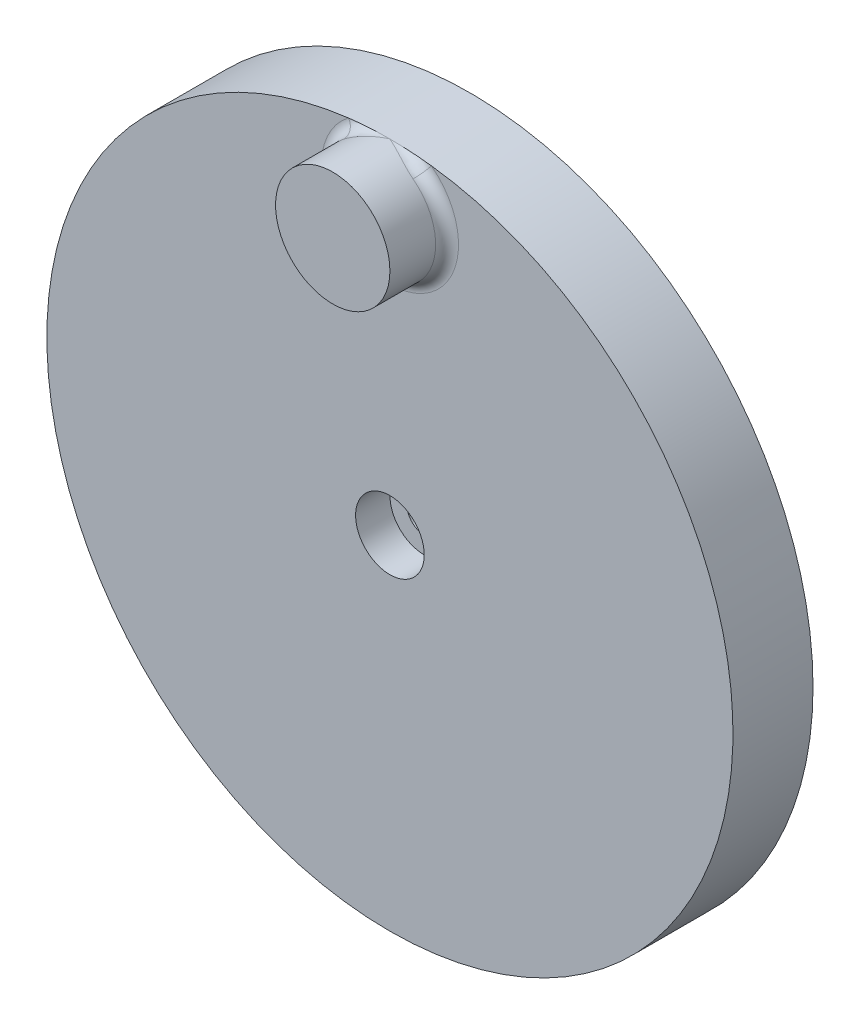
ISO-10303-21;
HEADER;
FILE_DESCRIPTION(('STEP AP214'),'2;1');
FILE_NAME('part.step','',(''),(''),'','','');
FILE_SCHEMA(('AUTOMOTIVE_DESIGN { 1 0 10303 214 1 1 1 1 }'));
ENDSEC;
DATA;
#1=APPLICATION_CONTEXT('core data for automotive mechanical design processes');
#2=APPLICATION_PROTOCOL_DEFINITION('international standard','automotive_design',2000,#1);
#3=PRODUCT_CONTEXT('',#1,'mechanical');
#4=PRODUCT('Part','Part','',(#3));
#5=PRODUCT_RELATED_PRODUCT_CATEGORY('part','',(#4));
#6=PRODUCT_DEFINITION_FORMATION('','',#4);
#7=PRODUCT_DEFINITION_CONTEXT('part definition',#1,'design');
#8=PRODUCT_DEFINITION('design','',#6,#7);
#9=PRODUCT_DEFINITION_SHAPE('','',#8);
#10=(LENGTH_UNIT() NAMED_UNIT(*) SI_UNIT(.MILLI.,.METRE.));
#11=(NAMED_UNIT(*) PLANE_ANGLE_UNIT() SI_UNIT($,.RADIAN.));
#12=(NAMED_UNIT(*) SI_UNIT($,.STERADIAN.) SOLID_ANGLE_UNIT());
#13=UNCERTAINTY_MEASURE_WITH_UNIT(LENGTH_MEASURE(1.E-05),#10,'distance_accuracy_value','');
#14=(GEOMETRIC_REPRESENTATION_CONTEXT(3) GLOBAL_UNCERTAINTY_ASSIGNED_CONTEXT((#13)) GLOBAL_UNIT_ASSIGNED_CONTEXT((#10,
#11,#12)) REPRESENTATION_CONTEXT('',''));
#15=CARTESIAN_POINT('',(0.,0.,0.));
#16=DIRECTION('',(0.,0.,1.));
#17=DIRECTION('',(1.,0.,0.));
#18=AXIS2_PLACEMENT_3D('',#15,#16,#17);
#19=CARTESIAN_POINT('',(0.,0.,7.));
#20=DIRECTION('',(0.,0.,-1.));
#21=DIRECTION('',(-1.,0.,0.));
#22=AXIS2_PLACEMENT_3D('',#19,#20,#21);
#23=CYLINDRICAL_SURFACE('',#22,1.5);
#24=CARTESIAN_POINT('',(0.,0.,2.));
#25=DIRECTION('',(0.,0.,-1.));
#26=DIRECTION('',(-1.,0.,0.));
#27=AXIS2_PLACEMENT_3D('',#24,#25,#26);
#28=CIRCLE('',#27,1.5);
#29=CARTESIAN_POINT('',(-1.5,0.,2.));
#30=VERTEX_POINT('',#29);
#31=EDGE_CURVE('E281',#30,#30,#28,.T.);
#32=ORIENTED_EDGE('',*,*,#31,.T.);
#33=EDGE_LOOP('',(#32));
#34=FACE_BOUND('',#33,.T.);
#35=CARTESIAN_POINT('',(0.,0.,4.));
#36=DIRECTION('',(0.,0.,1.));
#37=DIRECTION('',(1.,0.,0.));
#38=AXIS2_PLACEMENT_3D('',#35,#36,#37);
#39=CIRCLE('',#38,1.5);
#40=CARTESIAN_POINT('',(1.5,0.,4.));
#41=VERTEX_POINT('',#40);
#42=EDGE_CURVE('E182',#41,#41,#39,.F.);
#43=ORIENTED_EDGE('',*,*,#42,.F.);
#44=EDGE_LOOP('',(#43));
#45=FACE_BOUND('',#44,.T.);
#46=ADVANCED_FACE('F39',(#34,#45),#23,.F.);
#47=CARTESIAN_POINT('',(0.,0.,0.));
#48=DIRECTION('',(0.,0.,1.));
#49=DIRECTION('',(1.,0.,0.));
#50=AXIS2_PLACEMENT_3D('',#47,#48,#49);
#51=PLANE('',#50);
#52=CARTESIAN_POINT('',(0.,0.,0.));
#53=DIRECTION('',(0.,0.,1.));
#54=DIRECTION('',(1.,0.,0.));
#55=AXIS2_PLACEMENT_3D('',#52,#53,#54);
#56=CIRCLE('',#55,30.);
#57=CARTESIAN_POINT('',(30.,0.,0.));
#58=VERTEX_POINT('',#57);
#59=EDGE_CURVE('E143',#58,#58,#56,.T.);
#60=ORIENTED_EDGE('',*,*,#59,.F.);
#61=EDGE_LOOP('',(#60));
#62=FACE_BOUND('',#61,.T.);
#63=CARTESIAN_POINT('',(0.,16.5,0.));
#64=DIRECTION('',(0.,0.,1.));
#65=DIRECTION('',(-1.,0.,0.));
#66=AXIS2_PLACEMENT_3D('',#63,#64,#65);
#67=CIRCLE('',#66,2.5);
#68=CARTESIAN_POINT('',(2.4758529550033,16.8466296946331,0.));
#69=VERTEX_POINT('',#68);
#70=CARTESIAN_POINT('',(-2.4758529550033,16.8466296946331,0.));
#71=VERTEX_POINT('',#70);
#72=EDGE_CURVE('E270',#69,#71,#67,.T.);
#73=ORIENTED_EDGE('',*,*,#72,.T.);
#74=DIRECTION('',(-0.138651877853248,-0.990341182001318,0.));
#75=VECTOR('',#74,1.);
#76=CARTESIAN_POINT('',(-2.4758529550033,16.8466296946331,0.));
#77=LINE('',#76,#75);
#78=CARTESIAN_POINT('',(-4.3,3.81739439932528,0.));
#79=VERTEX_POINT('',#78);
#80=EDGE_CURVE('E280',#71,#79,#77,.T.);
#81=ORIENTED_EDGE('',*,*,#80,.T.);
#82=CARTESIAN_POINT('',(0.,0.,0.));
#83=DIRECTION('',(0.,0.,1.));
#84=DIRECTION('',(1.,0.,0.));
#85=AXIS2_PLACEMENT_3D('',#82,#83,#84);
#86=CIRCLE('',#85,5.75000000000004);
#87=CARTESIAN_POINT('',(-4.3,-3.81739439932528,0.));
#88=VERTEX_POINT('',#87);
#89=EDGE_CURVE('E342',#79,#88,#86,.T.);
#90=ORIENTED_EDGE('',*,*,#89,.T.);
#91=DIRECTION('',(0.138651877853248,-0.990341182001318,0.));
#92=VECTOR('',#91,1.);
#93=CARTESIAN_POINT('',(-4.3,-3.81739439932528,0.));
#94=LINE('',#93,#92);
#95=CARTESIAN_POINT('',(-2.4758529550033,-16.8466296946331,0.));
#96=VERTEX_POINT('',#95);
#97=EDGE_CURVE('E345',#88,#96,#94,.T.);
#98=ORIENTED_EDGE('',*,*,#97,.T.);
#99=CARTESIAN_POINT('',(0.,-16.5,0.));
#100=DIRECTION('',(0.,0.,1.));
#101=DIRECTION('',(1.,0.,0.));
#102=AXIS2_PLACEMENT_3D('',#99,#100,#101);
#103=CIRCLE('',#102,2.5);
#104=CARTESIAN_POINT('',(2.4758529550033,-16.8466296946331,0.));
#105=VERTEX_POINT('',#104);
#106=EDGE_CURVE('E348',#96,#105,#103,.T.);
#107=ORIENTED_EDGE('',*,*,#106,.T.);
#108=DIRECTION('',(0.138651877853248,0.990341182001318,0.));
#109=VECTOR('',#108,1.);
#110=CARTESIAN_POINT('',(4.3,-3.81739439932528,0.));
#111=LINE('',#110,#109);
#112=CARTESIAN_POINT('',(4.3,-3.81739439932528,0.));
#113=VERTEX_POINT('',#112);
#114=EDGE_CURVE('E298',#105,#113,#111,.T.);
#115=ORIENTED_EDGE('',*,*,#114,.T.);
#116=CARTESIAN_POINT('',(0.,0.,0.));
#117=DIRECTION('',(0.,0.,1.));
#118=DIRECTION('',(-1.,0.,0.));
#119=AXIS2_PLACEMENT_3D('',#116,#117,#118);
#120=CIRCLE('',#119,5.75000000000001);
#121=CARTESIAN_POINT('',(4.3,3.81739439932528,0.));
#122=VERTEX_POINT('',#121);
#123=EDGE_CURVE('E293',#113,#122,#120,.T.);
#124=ORIENTED_EDGE('',*,*,#123,.T.);
#125=DIRECTION('',(-0.138651877853248,0.990341182001318,0.));
#126=VECTOR('',#125,1.);
#127=CARTESIAN_POINT('',(2.4758529550033,16.8466296946331,0.));
#128=LINE('',#127,#126);
#129=EDGE_CURVE('E285',#122,#69,#128,.T.);
#130=ORIENTED_EDGE('',*,*,#129,.T.);
#131=EDGE_LOOP('',(#73,#81,#90,#98,#107,#115,#124,#130));
#132=FACE_BOUND('',#131,.T.);
#133=ADVANCED_FACE('F190',(#62,#132),#51,.F.);
#134=CARTESIAN_POINT('',(0.,0.,7.));
#135=DIRECTION('',(0.,0.,-1.));
#136=DIRECTION('',(-1.,0.,0.));
#137=AXIS2_PLACEMENT_3D('',#134,#135,#136);
#138=CYLINDRICAL_SURFACE('',#137,30.);
#139=CARTESIAN_POINT('',(0.,0.,7.));
#140=DIRECTION('',(0.,0.,1.));
#141=DIRECTION('',(1.,0.,0.));
#142=AXIS2_PLACEMENT_3D('',#139,#140,#141);
#143=CIRCLE('',#142,30.);
#144=CARTESIAN_POINT('',(0.,30.,7.));
#145=VERTEX_POINT('',#144);
#146=CARTESIAN_POINT('',(-3.62651347715682,29.78,7.));
#147=VERTEX_POINT('',#146);
#148=EDGE_CURVE('E132',#145,#147,#143,.T.);
#149=ORIENTED_EDGE('',*,*,#148,.F.);
#150=CARTESIAN_POINT('',(3.62651347715684,29.78,7.));
#151=VERTEX_POINT('',#150);
#152=EDGE_CURVE('E60',#151,#145,#143,.T.);
#153=ORIENTED_EDGE('',*,*,#152,.F.);
#154=EDGE_CURVE('E137',#147,#151,#143,.T.);
#155=ORIENTED_EDGE('',*,*,#154,.F.);
#156=EDGE_LOOP('',(#149,#153,#155));
#157=FACE_BOUND('',#156,.T.);
#158=ORIENTED_EDGE('',*,*,#59,.T.);
#159=EDGE_LOOP('',(#158));
#160=FACE_BOUND('',#159,.T.);
#161=ADVANCED_FACE('F135',(#157,#160),#138,.T.);
#162=CARTESIAN_POINT('',(0.,0.,7.));
#163=DIRECTION('',(0.,0.,1.));
#164=DIRECTION('',(1.,0.,0.));
#165=AXIS2_PLACEMENT_3D('',#162,#163,#164);
#166=PLANE('',#165);
#167=CARTESIAN_POINT('',(0.,0.,7.));
#168=DIRECTION('',(0.,0.,1.));
#169=DIRECTION('',(1.,0.,0.));
#170=AXIS2_PLACEMENT_3D('',#167,#168,#169);
#171=CIRCLE('',#170,3.);
#172=CARTESIAN_POINT('',(3.,0.,7.));
#173=VERTEX_POINT('',#172);
#174=EDGE_CURVE('E321',#173,#173,#171,.T.);
#175=ORIENTED_EDGE('',*,*,#174,.F.);
#176=EDGE_LOOP('',(#175));
#177=FACE_BOUND('',#176,.T.);
#178=ORIENTED_EDGE('',*,*,#154,.T.);
#179=CARTESIAN_POINT('',(0.,25.,7.));
#180=DIRECTION('',(0.,0.,1.));
#181=DIRECTION('',(1.,0.,0.));
#182=AXIS2_PLACEMENT_3D('',#179,#180,#181);
#183=CIRCLE('',#182,6.);
#184=EDGE_CURVE('E11',#151,#147,#183,.F.);
#185=ORIENTED_EDGE('',*,*,#184,.T.);
#186=EDGE_LOOP('',(#178,#185));
#187=FACE_BOUND('',#186,.T.);
#188=ADVANCED_FACE('F189',(#177,#187),#166,.T.);
#189=CARTESIAN_POINT('',(0.,16.5,2.));
#190=DIRECTION('',(0.,0.,-1.));
#191=DIRECTION('',(-1.,0.,0.));
#192=AXIS2_PLACEMENT_3D('',#189,#190,#191);
#193=CYLINDRICAL_SURFACE('',#192,2.5);
#194=ORIENTED_EDGE('',*,*,#72,.F.);
#195=DIRECTION('',(0.,0.,-1.));
#196=VECTOR('',#195,1.);
#197=CARTESIAN_POINT('',(2.4758529550033,16.8466296946331,2.));
#198=LINE('',#197,#196);
#199=CARTESIAN_POINT('',(2.4758529550033,16.8466296946331,2.));
#200=VERTEX_POINT('',#199);
#201=EDGE_CURVE('E273',#200,#69,#198,.T.);
#202=ORIENTED_EDGE('',*,*,#201,.F.);
#203=CARTESIAN_POINT('',(0.,16.5,2.));
#204=DIRECTION('',(0.,0.,1.));
#205=DIRECTION('',(-1.,0.,0.));
#206=AXIS2_PLACEMENT_3D('',#203,#204,#205);
#207=CIRCLE('',#206,2.5);
#208=CARTESIAN_POINT('',(-2.4758529550033,16.8466296946331,2.));
#209=VERTEX_POINT('',#208);
#210=EDGE_CURVE('E294',#200,#209,#207,.T.);
#211=ORIENTED_EDGE('',*,*,#210,.T.);
#212=DIRECTION('',(0.,0.,-1.));
#213=VECTOR('',#212,1.);
#214=CARTESIAN_POINT('',(-2.4758529550033,16.8466296946331,2.));
#215=LINE('',#214,#213);
#216=EDGE_CURVE('E276',#209,#71,#215,.T.);
#217=ORIENTED_EDGE('',*,*,#216,.T.);
#218=EDGE_LOOP('',(#194,#202,#211,#217));
#219=FACE_BOUND('',#218,.T.);
#220=ADVANCED_FACE('F259',(#219),#193,.F.);
#221=CARTESIAN_POINT('',(-2.4758529550033,16.8466296946331,2.));
#222=DIRECTION('',(0.990341182001318,-0.138651877853248,0.));
#223=DIRECTION('',(0.138651877853248,0.990341182001318,0.));
#224=AXIS2_PLACEMENT_3D('',#221,#222,#223);
#225=PLANE('',#224);
#226=ORIENTED_EDGE('',*,*,#80,.F.);
#227=ORIENTED_EDGE('',*,*,#216,.F.);
#228=DIRECTION('',(-0.138651877853248,-0.990341182001318,0.));
#229=VECTOR('',#228,1.);
#230=CARTESIAN_POINT('',(-2.4758529550033,16.8466296946331,2.));
#231=LINE('',#230,#229);
#232=CARTESIAN_POINT('',(-4.3,3.81739439932528,2.));
#233=VERTEX_POINT('',#232);
#234=EDGE_CURVE('E296',#209,#233,#231,.T.);
#235=ORIENTED_EDGE('',*,*,#234,.T.);
#236=DIRECTION('',(0.,0.,-1.));
#237=VECTOR('',#236,1.);
#238=CARTESIAN_POINT('',(-4.3,3.81739439932528,2.));
#239=LINE('',#238,#237);
#240=EDGE_CURVE('E311',#233,#79,#239,.T.);
#241=ORIENTED_EDGE('',*,*,#240,.T.);
#242=EDGE_LOOP('',(#226,#227,#235,#241));
#243=FACE_BOUND('',#242,.T.);
#244=ADVANCED_FACE('F256',(#243),#225,.T.);
#245=CARTESIAN_POINT('',(0.,0.,2.));
#246=DIRECTION('',(0.,0.,-1.));
#247=DIRECTION('',(-1.,0.,0.));
#248=AXIS2_PLACEMENT_3D('',#245,#246,#247);
#249=CYLINDRICAL_SURFACE('',#248,5.75000000000004);
#250=ORIENTED_EDGE('',*,*,#89,.F.);
#251=ORIENTED_EDGE('',*,*,#240,.F.);
#252=CARTESIAN_POINT('',(0.,0.,2.));
#253=DIRECTION('',(0.,0.,1.));
#254=DIRECTION('',(1.,0.,0.));
#255=AXIS2_PLACEMENT_3D('',#252,#253,#254);
#256=CIRCLE('',#255,5.75000000000004);
#257=CARTESIAN_POINT('',(-4.3,-3.81739439932528,2.));
#258=VERTEX_POINT('',#257);
#259=EDGE_CURVE('E330',#233,#258,#256,.T.);
#260=ORIENTED_EDGE('',*,*,#259,.T.);
#261=DIRECTION('',(0.,0.,-1.));
#262=VECTOR('',#261,1.);
#263=CARTESIAN_POINT('',(-4.3,-3.81739439932528,2.));
#264=LINE('',#263,#262);
#265=EDGE_CURVE('E309',#258,#88,#264,.T.);
#266=ORIENTED_EDGE('',*,*,#265,.T.);
#267=EDGE_LOOP('',(#250,#251,#260,#266));
#268=FACE_BOUND('',#267,.T.);
#269=ADVANCED_FACE('F252',(#268),#249,.F.);
#270=CARTESIAN_POINT('',(-4.3,-3.81739439932528,2.));
#271=DIRECTION('',(0.990341182001318,0.138651877853248,0.));
#272=DIRECTION('',(-0.138651877853248,0.990341182001318,0.));
#273=AXIS2_PLACEMENT_3D('',#270,#271,#272);
#274=PLANE('',#273);
#275=ORIENTED_EDGE('',*,*,#97,.F.);
#276=ORIENTED_EDGE('',*,*,#265,.F.);
#277=DIRECTION('',(0.138651877853248,-0.990341182001318,0.));
#278=VECTOR('',#277,1.);
#279=CARTESIAN_POINT('',(-4.3,-3.81739439932528,2.));
#280=LINE('',#279,#278);
#281=CARTESIAN_POINT('',(-2.4758529550033,-16.8466296946331,2.));
#282=VERTEX_POINT('',#281);
#283=EDGE_CURVE('E332',#258,#282,#280,.T.);
#284=ORIENTED_EDGE('',*,*,#283,.T.);
#285=DIRECTION('',(0.,0.,-1.));
#286=VECTOR('',#285,1.);
#287=CARTESIAN_POINT('',(-2.4758529550033,-16.8466296946331,2.));
#288=LINE('',#287,#286);
#289=EDGE_CURVE('E307',#282,#96,#288,.T.);
#290=ORIENTED_EDGE('',*,*,#289,.T.);
#291=EDGE_LOOP('',(#275,#276,#284,#290));
#292=FACE_BOUND('',#291,.T.);
#293=ADVANCED_FACE('F248',(#292),#274,.T.);
#294=CARTESIAN_POINT('',(0.,-16.5,2.));
#295=DIRECTION('',(0.,0.,-1.));
#296=DIRECTION('',(-1.,0.,0.));
#297=AXIS2_PLACEMENT_3D('',#294,#295,#296);
#298=CYLINDRICAL_SURFACE('',#297,2.5);
#299=ORIENTED_EDGE('',*,*,#106,.F.);
#300=ORIENTED_EDGE('',*,*,#289,.F.);
#301=CARTESIAN_POINT('',(0.,-16.5,2.));
#302=DIRECTION('',(0.,0.,1.));
#303=DIRECTION('',(1.,0.,0.));
#304=AXIS2_PLACEMENT_3D('',#301,#302,#303);
#305=CIRCLE('',#304,2.5);
#306=CARTESIAN_POINT('',(2.4758529550033,-16.8466296946331,2.));
#307=VERTEX_POINT('',#306);
#308=EDGE_CURVE('E334',#282,#307,#305,.T.);
#309=ORIENTED_EDGE('',*,*,#308,.T.);
#310=DIRECTION('',(0.,0.,-1.));
#311=VECTOR('',#310,1.);
#312=CARTESIAN_POINT('',(2.4758529550033,-16.8466296946331,2.));
#313=LINE('',#312,#311);
#314=EDGE_CURVE('E305',#307,#105,#313,.T.);
#315=ORIENTED_EDGE('',*,*,#314,.T.);
#316=EDGE_LOOP('',(#299,#300,#309,#315));
#317=FACE_BOUND('',#316,.T.);
#318=ADVANCED_FACE('F244',(#317),#298,.F.);
#319=CARTESIAN_POINT('',(4.3,-3.81739439932528,2.));
#320=DIRECTION('',(-0.990341182001318,0.138651877853248,0.));
#321=DIRECTION('',(-0.138651877853248,-0.990341182001318,0.));
#322=AXIS2_PLACEMENT_3D('',#319,#320,#321);
#323=PLANE('',#322);
#324=ORIENTED_EDGE('',*,*,#114,.F.);
#325=ORIENTED_EDGE('',*,*,#314,.F.);
#326=DIRECTION('',(0.138651877853248,0.990341182001318,0.));
#327=VECTOR('',#326,1.);
#328=CARTESIAN_POINT('',(4.3,-3.81739439932528,2.));
#329=LINE('',#328,#327);
#330=CARTESIAN_POINT('',(4.3,-3.81739439932528,2.));
#331=VERTEX_POINT('',#330);
#332=EDGE_CURVE('E336',#307,#331,#329,.T.);
#333=ORIENTED_EDGE('',*,*,#332,.T.);
#334=DIRECTION('',(0.,0.,-1.));
#335=VECTOR('',#334,1.);
#336=CARTESIAN_POINT('',(4.3,-3.81739439932528,2.));
#337=LINE('',#336,#335);
#338=EDGE_CURVE('E303',#331,#113,#337,.T.);
#339=ORIENTED_EDGE('',*,*,#338,.T.);
#340=EDGE_LOOP('',(#324,#325,#333,#339));
#341=FACE_BOUND('',#340,.T.);
#342=ADVANCED_FACE('F240',(#341),#323,.T.);
#343=CARTESIAN_POINT('',(0.,0.,2.));
#344=DIRECTION('',(0.,0.,-1.));
#345=DIRECTION('',(-1.,0.,0.));
#346=AXIS2_PLACEMENT_3D('',#343,#344,#345);
#347=CYLINDRICAL_SURFACE('',#346,5.75000000000001);
#348=ORIENTED_EDGE('',*,*,#123,.F.);
#349=ORIENTED_EDGE('',*,*,#338,.F.);
#350=CARTESIAN_POINT('',(0.,0.,2.));
#351=DIRECTION('',(0.,0.,1.));
#352=DIRECTION('',(-1.,0.,0.));
#353=AXIS2_PLACEMENT_3D('',#350,#351,#352);
#354=CIRCLE('',#353,5.75000000000001);
#355=CARTESIAN_POINT('',(4.3,3.81739439932528,2.));
#356=VERTEX_POINT('',#355);
#357=EDGE_CURVE('E338',#331,#356,#354,.T.);
#358=ORIENTED_EDGE('',*,*,#357,.T.);
#359=DIRECTION('',(0.,0.,-1.));
#360=VECTOR('',#359,1.);
#361=CARTESIAN_POINT('',(4.3,3.81739439932528,2.));
#362=LINE('',#361,#360);
#363=EDGE_CURVE('E289',#356,#122,#362,.T.);
#364=ORIENTED_EDGE('',*,*,#363,.T.);
#365=EDGE_LOOP('',(#348,#349,#358,#364));
#366=FACE_BOUND('',#365,.T.);
#367=ADVANCED_FACE('F236',(#366),#347,.F.);
#368=CARTESIAN_POINT('',(2.4758529550033,16.8466296946331,2.));
#369=DIRECTION('',(-0.990341182001318,-0.138651877853248,0.));
#370=DIRECTION('',(0.138651877853248,-0.990341182001318,0.));
#371=AXIS2_PLACEMENT_3D('',#368,#369,#370);
#372=PLANE('',#371);
#373=ORIENTED_EDGE('',*,*,#129,.F.);
#374=ORIENTED_EDGE('',*,*,#363,.F.);
#375=DIRECTION('',(-0.138651877853248,0.990341182001318,0.));
#376=VECTOR('',#375,1.);
#377=CARTESIAN_POINT('',(2.4758529550033,16.8466296946331,2.));
#378=LINE('',#377,#376);
#379=EDGE_CURVE('E288',#356,#200,#378,.T.);
#380=ORIENTED_EDGE('',*,*,#379,.T.);
#381=ORIENTED_EDGE('',*,*,#201,.T.);
#382=EDGE_LOOP('',(#373,#374,#380,#381));
#383=FACE_BOUND('',#382,.T.);
#384=ADVANCED_FACE('F232',(#383),#372,.T.);
#385=CARTESIAN_POINT('',(0.,16.5,2.));
#386=DIRECTION('',(0.,0.,-1.));
#387=DIRECTION('',(-1.,0.,0.));
#388=AXIS2_PLACEMENT_3D('',#385,#386,#387);
#389=PLANE('',#388);
#390=ORIENTED_EDGE('',*,*,#31,.F.);
#391=EDGE_LOOP('',(#390));
#392=FACE_BOUND('',#391,.T.);
#393=ORIENTED_EDGE('',*,*,#210,.F.);
#394=ORIENTED_EDGE('',*,*,#379,.F.);
#395=ORIENTED_EDGE('',*,*,#357,.F.);
#396=ORIENTED_EDGE('',*,*,#332,.F.);
#397=ORIENTED_EDGE('',*,*,#308,.F.);
#398=ORIENTED_EDGE('',*,*,#283,.F.);
#399=ORIENTED_EDGE('',*,*,#259,.F.);
#400=ORIENTED_EDGE('',*,*,#234,.F.);
#401=EDGE_LOOP('',(#393,#394,#395,#396,#397,#398,#399,#400));
#402=FACE_BOUND('',#401,.T.);
#403=ADVANCED_FACE('F229',(#392,#402),#389,.T.);
#404=CARTESIAN_POINT('',(0.,0.,4.));
#405=DIRECTION('',(0.,0.,1.));
#406=DIRECTION('',(1.,0.,0.));
#407=AXIS2_PLACEMENT_3D('',#404,#405,#406);
#408=PLANE('',#407);
#409=CARTESIAN_POINT('',(0.,0.,4.));
#410=DIRECTION('',(0.,0.,1.));
#411=DIRECTION('',(1.,0.,0.));
#412=AXIS2_PLACEMENT_3D('',#409,#410,#411);
#413=CIRCLE('',#412,3.);
#414=CARTESIAN_POINT('',(3.,0.,4.));
#415=VERTEX_POINT('',#414);
#416=EDGE_CURVE('E317',#415,#415,#413,.T.);
#417=ORIENTED_EDGE('',*,*,#416,.T.);
#418=EDGE_LOOP('',(#417));
#419=FACE_BOUND('',#418,.T.);
#420=ORIENTED_EDGE('',*,*,#42,.T.);
#421=EDGE_LOOP('',(#420));
#422=FACE_BOUND('',#421,.T.);
#423=ADVANCED_FACE('F165',(#419,#422),#408,.T.);
#424=CARTESIAN_POINT('',(0.,0.,4.));
#425=DIRECTION('',(0.,0.,1.));
#426=DIRECTION('',(1.,0.,0.));
#427=AXIS2_PLACEMENT_3D('',#424,#425,#426);
#428=CYLINDRICAL_SURFACE('',#427,3.);
#429=ORIENTED_EDGE('',*,*,#416,.F.);
#430=EDGE_LOOP('',(#429));
#431=FACE_BOUND('',#430,.T.);
#432=ORIENTED_EDGE('',*,*,#174,.T.);
#433=EDGE_LOOP('',(#432));
#434=FACE_BOUND('',#433,.T.);
#435=ADVANCED_FACE('F163',(#431,#434),#428,.F.);
#436=CARTESIAN_POINT('',(0.,25.,12.));
#437=DIRECTION('',(0.,0.,-1.));
#438=DIRECTION('',(-1.,0.,0.));
#439=AXIS2_PLACEMENT_3D('',#436,#437,#438);
#440=CYLINDRICAL_SURFACE('',#439,5.);
#441=CARTESIAN_POINT('',(0.,25.,12.));
#442=DIRECTION('',(0.,0.,1.));
#443=DIRECTION('',(1.,0.,0.));
#444=AXIS2_PLACEMENT_3D('',#441,#442,#443);
#445=CIRCLE('',#444,5.);
#446=CARTESIAN_POINT('',(5.,25.,12.));
#447=VERTEX_POINT('',#446);
#448=EDGE_CURVE('E202',#447,#447,#445,.T.);
#449=ORIENTED_EDGE('',*,*,#448,.F.);
#450=EDGE_LOOP('',(#449));
#451=FACE_BOUND('',#450,.T.);
#452=CARTESIAN_POINT('',(3.49751444341482,28.5731488519378,7.91071847256837));
#453=CARTESIAN_POINT('',(3.23589622093356,28.829229286788,6.54499465269175));
#454=CARTESIAN_POINT('',(4.25560678164064,29.6966296222325,7.));
#455=CARTESIAN_POINT('',(3.45742504896842,28.6124059696088,7.92872690247468));
#456=CARTESIAN_POINT('',(3.2332644081291,28.8262317253096,6.59608595755505));
#457=CARTESIAN_POINT('',(4.20109926721259,29.7044425151045,7.));
#458=CARTESIAN_POINT('',(3.41620112198342,28.6514201663665,7.94353462789859));
#459=CARTESIAN_POINT('',(3.22467851641795,28.8300454150341,6.64604082285603));
#460=CARTESIAN_POINT('',(4.14548483249896,29.7122573446972,7.));
#461=CARTESIAN_POINT('',(3.33191687982114,28.7284784498066,7.96756306989895));
#462=CARTESIAN_POINT('',(3.19764857214136,28.8478917514601,6.73970360863722));
#463=CARTESIAN_POINT('',(4.03262931023606,29.7277834460882,7.));
#464=CARTESIAN_POINT('',(3.28886067687245,28.7665244312886,7.97679565721087));
#465=CARTESIAN_POINT('',(3.17958349476997,28.8615234710273,6.78373969819387));
#466=CARTESIAN_POINT('',(3.975391952458,29.7354949034872,7.));
#467=CARTESIAN_POINT('',(3.20157847278317,28.8409849991536,7.99049393032906));
#468=CARTESIAN_POINT('',(3.13597019603504,28.8952540560613,6.86458730841356));
#469=CARTESIAN_POINT('',(3.86017962454435,29.7506700273833,7.));
#470=CARTESIAN_POINT('',(3.15736709317656,28.8774114755715,7.99500319287466));
#471=CARTESIAN_POINT('',(3.11072196475326,28.9150914669205,6.90175657284064));
#472=CARTESIAN_POINT('',(3.80221648156478,29.7581353323496,7.));
#473=CARTESIAN_POINT('',(3.0675968283844,28.9488152127689,8.0000482633028));
#474=CARTESIAN_POINT('',(3.05427661559629,28.9588498221576,6.96969160814069));
#475=CARTESIAN_POINT('',(3.68528652941521,29.7728423067249,7.));
#476=CARTESIAN_POINT('',(3.02203697560463,28.9837913874523,8.00058114496517));
#477=CARTESIAN_POINT('',(3.02320846151453,28.9826868865172,7.00071547519962));
#478=CARTESIAN_POINT('',(3.62631901310338,29.7800838075346,7.));
#479=CARTESIAN_POINT('',(2.89976167583425,29.0743528145851,7.99745327916111));
#480=CARTESIAN_POINT('',(2.93537574121987,29.0483515375789,7.0743642582162));
#481=CARTESIAN_POINT('',(3.46901518780202,29.7989203255049,7.));
#482=CARTESIAN_POINT('',(2.82205793742418,29.1285443079758,7.99083912873388));
#483=CARTESIAN_POINT('',(2.87394312704376,29.0927375661984,7.11331247217184));
#484=CARTESIAN_POINT('',(3.3700212790241,29.8102831055155,7.));
#485=CARTESIAN_POINT('',(2.66420965704834,29.2321295821103,7.97022421862164));
#486=CARTESIAN_POINT('',(2.74191097010536,29.1828323229919,7.17738274001889));
#487=CARTESIAN_POINT('',(3.17068849385632,29.8321440389851,7.));
#488=CARTESIAN_POINT('',(2.58406427383196,29.281521684132,7.95622088529673));
#489=CARTESIAN_POINT('',(2.67137452685739,29.2286872134719,7.20317521252147));
#490=CARTESIAN_POINT('',(3.070349160732,29.8426418897171,7.));
#491=CARTESIAN_POINT('',(2.3395712853325,29.4228891586841,7.90518529847535));
#492=CARTESIAN_POINT('',(2.45250381140607,29.3620785609924,7.2629597624895));
#493=CARTESIAN_POINT('',(2.76659863005117,29.8728541016265,7.));
#494=CARTESIAN_POINT('',(2.17211097202775,29.507359812135,7.85919053822044));
#495=CARTESIAN_POINT('',(2.28970235164014,29.4507711563278,7.28346241791361));
#496=CARTESIAN_POINT('',(2.56166566647933,29.8911412491111,7.));
#497=CARTESIAN_POINT('',(1.87670591066526,29.6364587729294,7.76605433189887));
#498=CARTESIAN_POINT('',(1.9931011848911,29.5892769040199,7.29315416438341));
#499=CARTESIAN_POINT('',(2.20429289206909,29.9192969167835,7.));
#500=CARTESIAN_POINT('',(1.74993217198395,29.6857246943264,7.72238571647082));
#501=CARTESIAN_POINT('',(1.86349669919634,29.6434760972663,7.28981087121963));
#502=CARTESIAN_POINT('',(2.05220023549968,29.9301151109231,7.));
#503=CARTESIAN_POINT('',(1.49416430271313,29.7734421853778,7.6289797179822));
#504=CARTESIAN_POINT('',(1.59918183179588,29.7406396035453,7.27201244110473));
#505=CARTESIAN_POINT('',(1.74734888958902,29.9494592567276,7.));
#506=CARTESIAN_POINT('',(1.36516914093643,29.8118885806951,7.57923944745738));
#507=CARTESIAN_POINT('',(1.46370947005527,29.7842187078289,7.25778085095143));
#508=CARTESIAN_POINT('',(1.5945899169311,29.9579841115387,7.));
#509=CARTESIAN_POINT('',(0.976552198711398,29.910973057226,7.42402434995365));
#510=CARTESIAN_POINT('',(1.05718847207573,29.8953423445441,7.20431742775289));
#511=CARTESIAN_POINT('',(1.1365895344099,29.9800145665757,7.));
#512=CARTESIAN_POINT('',(0.714437828483863,29.9557270606297,7.31225971308038));
#513=CARTESIAN_POINT('',(0.7727237693731,29.9484217646634,7.15339280627614));
#514=CARTESIAN_POINT('',(0.830589850956688,29.9900578296576,7.));
#515=CARTESIAN_POINT('',(0.305685978162227,29.9927970106045,7.13445435829463));
#516=CARTESIAN_POINT('',(0.330896116055844,29.9916202297781,7.06731893987037));
#517=CARTESIAN_POINT('',(0.35500017449023,29.9983810308153,7.));
#518=CARTESIAN_POINT('',(0.159586481099195,29.9995876192669,7.07020781356275));
#519=CARTESIAN_POINT('',(0.17247300836852,29.9995210506366,7.03510664513112));
#520=CARTESIAN_POINT('',(0.18532653491921,29.9999073104762,7.));
#521=CARTESIAN_POINT('',(0.0089982649691203,29.9999939210952,7.0039587156446));
#522=CARTESIAN_POINT('',(0.00972394895875305,29.9999929407941,7.00197935325542));
#523=CARTESIAN_POINT('',(0.0104495980152107,29.9999986336849,7.));
#524=CARTESIAN_POINT('',(0.00449912389046995,29.9999999933807,7.00197935751754));
#525=CARTESIAN_POINT('',(0.00486195769726761,29.9999999940207,7.00098967065697));
#526=CARTESIAN_POINT('',(0.0052247890251888,29.999999998557,7.));
#527=CARTESIAN_POINT('',(0.,30.,7.));
#528=CARTESIAN_POINT('',(0.,30.,7.));
#529=CARTESIAN_POINT('',(0.,30.,7.));
#530=(BOUNDED_SURFACE() B_SPLINE_SURFACE(3,2,((#452,#453,#454),(#455,#456,#457),(#458,#459,
#460),(#461,#462,#463),(#464,#465,#466),(#467,#468,#469),(#470,#471,#472),(#473,#474,#475),
(#476,#477,#478),(#479,#480,#481),(#482,#483,#484),(#485,#486,#487),(#488,#489,#490),(#491,#492,
#493),(#494,#495,#496),(#497,#498,#499),(#500,#501,#502),(#503,#504,#505),(#506,#507,#508),
(#509,#510,#511),(#512,#513,#514),(#515,#516,#517),(#518,#519,#520),(#521,#522,#523),(#524,#525,
#526),(#527,#528,#529)),.UNSPECIFIED.,.F.,.F.,.F.) B_SPLINE_SURFACE_WITH_KNOTS((4,2,2,2,2,2,2,2,
2,2,2,2,4),(3,3),(0.,0.208885570873592,0.417324794085169,0.623823578273927,0.830474310022276,
1.17154957535487,1.51274371511524,2.19931170740612,2.70558777763613,3.21210555978267,
4.2216926721356,4.78184217597676,4.79909327675251),(0.,1.),
.UNSPECIFIED.) GEOMETRIC_REPRESENTATION_ITEM() RATIONAL_B_SPLINE_SURFACE(((1.,0.577425066399153,
1.),(1.,0.590333146487257,1.),(1.,0.602992982531281,1.),(1.,0.627721319078891,1.),(1.,
0.63979102534704,1.),(1.,0.663190573152909,1.),(1.,0.674526256354562,1.),(1.,0.696567187989541,
1.),(1.,0.707271966393775,1.),(1.,0.734795129573217,1.),(1.,0.751060752458776,1.),(1.,
0.781868700461234,1.),(1.,0.796410422984044,1.),(1.,0.837728329986869,1.),(1.,0.861988667427233,
1.),(1.,0.898733242949333,1.),(1.,0.912636923106477,1.),(1.,0.937264517691688,1.),(1.,
0.947986910831648,1.),(1.,0.975532025542034,1.),(1.,0.987836652868097,1.),(1.,0.998022960540597,
1.),(1.,0.999886817338651,1.),(1.,0.999998331717849,1.),(1.,0.99999999824046,1.),(1.,1.,1.))) REPRESENTATION_ITEM('') SURFACE());
#531=CARTESIAN_POINT('',(3.49751444341482,28.5731488519378,7.91071847256837));
#532=CARTESIAN_POINT('',(3.45742504896842,28.6124059696088,7.92872690247468));
#533=CARTESIAN_POINT('',(3.41620112198342,28.6514201663665,7.94353462789859));
#534=CARTESIAN_POINT('',(3.33191687982114,28.7284784498066,7.96756306989895));
#535=CARTESIAN_POINT('',(3.28886067687245,28.7665244312886,7.97679565721087));
#536=CARTESIAN_POINT('',(3.20157847278317,28.8409849991536,7.99049393032906));
#537=CARTESIAN_POINT('',(3.15736709317656,28.8774114755715,7.99500319287466));
#538=CARTESIAN_POINT('',(3.0675968283844,28.9488152127689,8.0000482633028));
#539=CARTESIAN_POINT('',(3.02203697560463,28.9837913874523,8.00058114496517));
#540=CARTESIAN_POINT('',(2.89976167583425,29.0743528145851,7.99745327916111));
#541=CARTESIAN_POINT('',(2.82205793742418,29.1285443079758,7.99083912873388));
#542=CARTESIAN_POINT('',(2.66420965704834,29.2321295821103,7.97022421862165));
#543=CARTESIAN_POINT('',(2.58406427383196,29.281521684132,7.95622088529673));
#544=CARTESIAN_POINT('',(2.3395712853325,29.4228891586841,7.90518529847535));
#545=CARTESIAN_POINT('',(2.17211097202775,29.507359812135,7.85919053822044));
#546=CARTESIAN_POINT('',(1.87670591066526,29.6364587729294,7.76605433189887));
#547=CARTESIAN_POINT('',(1.74993217198395,29.6857246943264,7.72238571647082));
#548=CARTESIAN_POINT('',(1.49416430271313,29.7734421853778,7.62897971798221));
#549=CARTESIAN_POINT('',(1.36516914093643,29.8118885806951,7.57923944745738));
#550=CARTESIAN_POINT('',(0.976552198711397,29.910973057226,7.42402434995365));
#551=CARTESIAN_POINT('',(0.714437828483861,29.9557270606297,7.31225971308038));
#552=CARTESIAN_POINT('',(0.305685978162228,29.9927970106045,7.13445435829462));
#553=CARTESIAN_POINT('',(0.159586481099199,29.9995876192669,7.07020781356275));
#554=CARTESIAN_POINT('',(0.00899826496912031,29.9999939210952,7.0039587156446));
#555=CARTESIAN_POINT('',(0.00449912389046996,29.9999999933807,7.00197935751754));
#556=CARTESIAN_POINT('',(0.,30.,7.));
#557=B_SPLINE_CURVE_WITH_KNOTS('',3,(#531,#532,#533,#534,#535,#536,#537,#538,#539,#540,#541,
#542,#543,#544,#545,#546,#547,#548,#549,#550,#551,#552,#553,#554,#555,#556),.UNSPECIFIED.,.F.,
.F.,(4,2,2,2,2,2,2,2,2,2,2,2,4),(0.,0.208885570873592,0.417324794085169,0.623823578273927,
0.830474310022276,1.17154957535487,1.51274371511524,2.19931170740612,2.70558777763613,
3.21210555978267,4.2216926721356,4.78184217597676,4.79909327675251),.UNSPECIFIED.);
#558=CARTESIAN_POINT('',(3.02209456429735,28.9833333333333,8.));
#559=VERTEX_POINT('',#558);
#560=EDGE_CURVE('E124',#559,#145,#557,.T.);
#561=ORIENTED_EDGE('',*,*,#560,.T.);
#562=CARTESIAN_POINT('',(-4.25560676562026,29.6966296245282,7.));
#563=CARTESIAN_POINT('',(-3.23589621069628,28.8292292968086,6.54499467228279));
#564=CARTESIAN_POINT('',(-3.49751444341486,28.5731488519378,7.91071847256836));
#565=CARTESIAN_POINT('',(-4.20109926146631,29.704442515928,7.));
#566=CARTESIAN_POINT('',(-3.23326440454399,28.8262317288329,6.59608596429984));
#567=CARTESIAN_POINT('',(-3.45742504896847,28.6124059696088,7.92872690247467));
#568=CARTESIAN_POINT('',(-4.14548483096094,29.7122573449176,7.));
#569=CARTESIAN_POINT('',(-3.22467851548414,28.8300454159548,6.64604082459044));
#570=CARTESIAN_POINT('',(-3.41620112198347,28.6514201663664,7.94353462789857));
#571=CARTESIAN_POINT('',(-4.03262931177042,29.7277834458683,7.));
#572=CARTESIAN_POINT('',(-3.19764857301907,28.8478917505891,6.73970360703424));
#573=CARTESIAN_POINT('',(-3.33191687982119,28.7284784498066,7.96756306989894));
#574=CARTESIAN_POINT('',(-3.97539195286788,29.7354949034285,7.));
#575=CARTESIAN_POINT('',(-3.17958349499701,28.8615234708013,6.78373969778105));
#576=CARTESIAN_POINT('',(-3.2888606768725,28.7665244312885,7.97679565721086));
#577=CARTESIAN_POINT('',(-3.86017962413838,29.7506700274415,7.));
#578=CARTESIAN_POINT('',(-3.13597019582497,28.895254056272,6.86458730879525));
#579=CARTESIAN_POINT('',(-3.20157847278323,28.8409849991536,7.99049393032906));
#580=CARTESIAN_POINT('',(-3.8022164814542,29.7581353323654,7.));
#581=CARTESIAN_POINT('',(-3.11072196469806,28.9150914669761,6.90175657294129));
#582=CARTESIAN_POINT('',(-3.15736709317662,28.8774114755714,7.99500319287465));
#583=CARTESIAN_POINT('',(-3.68528652952595,29.772842306709,7.));
#584=CARTESIAN_POINT('',(-3.05427661564747,28.9588498221055,6.9696916080459));
#585=CARTESIAN_POINT('',(-3.06759682838447,28.9488152127688,8.0000482633028));
#586=CARTESIAN_POINT('',(-3.62631901313978,29.7800838075294,7.));
#587=CARTESIAN_POINT('',(-3.02320846153069,28.9826868865007,7.00071547516935));
#588=CARTESIAN_POINT('',(-3.0220369756047,28.9837913874522,8.00058114496517));
#589=CARTESIAN_POINT('',(-3.46901518774216,29.7989203255135,7.));
#590=CARTESIAN_POINT('',(-2.93537574119617,29.0483515376037,7.07436425826262));
#591=CARTESIAN_POINT('',(-2.89976167583433,29.0743528145851,7.99745327916112));
#592=CARTESIAN_POINT('',(-3.37002127900785,29.8102831055178,7.));
#593=CARTESIAN_POINT('',(-2.87394312703785,29.0927375662047,7.11331247218401));
#594=CARTESIAN_POINT('',(-2.82205793742426,29.1285443079758,7.99083912873388));
#595=CARTESIAN_POINT('',(-3.17068849387282,29.8321440389828,7.));
#596=CARTESIAN_POINT('',(-2.74191097011048,29.1828323229862,7.17738274000747));
#597=CARTESIAN_POINT('',(-2.66420965704843,29.2321295821102,7.97022421862166));
#598=CARTESIAN_POINT('',(-3.07034916073762,29.8426418897162,7.));
#599=CARTESIAN_POINT('',(-2.67137452685894,29.2286872134701,7.20317521251765));
#600=CARTESIAN_POINT('',(-2.58406427383206,29.281521684132,7.95622088529675));
#601=CARTESIAN_POINT('',(-2.76659863003941,29.8728541016282,7.));
#602=CARTESIAN_POINT('',(-2.45250381140364,29.3620785609955,7.26295976249671));
#603=CARTESIAN_POINT('',(-2.33957128533261,29.4228891586841,7.90518529847538));
#604=CARTESIAN_POINT('',(-2.56166566647664,29.8911412491115,7.));
#605=CARTESIAN_POINT('',(-2.28970235163975,29.4507711563284,7.28346241791521));
#606=CARTESIAN_POINT('',(-2.17211097202787,29.5073598121349,7.85919053822048));
#607=CARTESIAN_POINT('',(-2.20429289207145,29.9192969167832,7.));
#608=CARTESIAN_POINT('',(-1.99310118489148,29.5892769040194,7.29315416438226));
#609=CARTESIAN_POINT('',(-1.87670591066539,29.6364587729294,7.76605433189891));
#610=CARTESIAN_POINT('',(-2.05220023550084,29.930115110923,7.));
#611=CARTESIAN_POINT('',(-1.86349669919676,29.643476097266,7.28981087121929));
#612=CARTESIAN_POINT('',(-1.74993217198409,29.6857246943264,7.72238571647086));
#613=CARTESIAN_POINT('',(-1.74734888958953,29.9494592567276,7.));
#614=CARTESIAN_POINT('',(-1.59918183179653,29.7406396035452,7.272012441105));
#615=CARTESIAN_POINT('',(-1.49416430271328,29.7734421853778,7.62897971798226));
#616=CARTESIAN_POINT('',(-1.59458991693216,29.9579841115387,7.));
#617=CARTESIAN_POINT('',(-1.46370947005598,29.7842187078287,7.25778085095152));
#618=CARTESIAN_POINT('',(-1.36516914093658,29.8118885806951,7.57923944745744));
#619=CARTESIAN_POINT('',(-1.13658953441079,29.9800145665756,7.));
#620=CARTESIAN_POINT('',(-1.05718847207608,29.8953423445439,7.20431742775271));
#621=CARTESIAN_POINT('',(-0.976552198711566,29.910973057226,7.42402434995372));
#622=CARTESIAN_POINT('',(-0.830589850955088,29.9900578296576,7.));
#623=CARTESIAN_POINT('',(-0.772723769372696,29.9484217646634,7.15339280627612));
#624=CARTESIAN_POINT('',(-0.714437828484049,29.9557270606297,7.31225971308043));
#625=CARTESIAN_POINT('',(-0.355000174490052,29.9983810308153,7.));
#626=CARTESIAN_POINT('',(-0.330896116055643,29.9916202297781,7.06731893987043));
#627=CARTESIAN_POINT('',(-0.305685978162345,29.9927970106045,7.1344543582947));
#628=CARTESIAN_POINT('',(-0.185326534920555,29.9999073104762,7.));
#629=CARTESIAN_POINT('',(-0.172473008368599,29.9995210506366,7.03510664513116));
#630=CARTESIAN_POINT('',(-0.15958648109924,29.9995876192669,7.07020781356283));
#631=CARTESIAN_POINT('',(-0.0104495980152364,29.9999986336849,7.));
#632=CARTESIAN_POINT('',(-0.00972394895878433,29.9999929407941,7.00197935325542));
#633=CARTESIAN_POINT('',(-0.00899826496911929,29.9999939210952,7.0039587156446));
#634=CARTESIAN_POINT('',(-0.00522478902517455,29.999999998557,7.));
#635=CARTESIAN_POINT('',(-0.00486195769729914,29.9999999940207,7.00098967065697));
#636=CARTESIAN_POINT('',(-0.00449912389046943,29.9999999933807,7.00197935751754));
#637=CARTESIAN_POINT('',(0.,30.,7.));
#638=CARTESIAN_POINT('',(0.,30.,7.));
#639=CARTESIAN_POINT('',(0.,30.,7.));
#640=(BOUNDED_SURFACE() B_SPLINE_SURFACE(3,2,((#562,#563,#564),(#565,#566,#567),(#568,#569,
#570),(#571,#572,#573),(#574,#575,#576),(#577,#578,#579),(#580,#581,#582),(#583,#584,#585),
(#586,#587,#588),(#589,#590,#591),(#592,#593,#594),(#595,#596,#597),(#598,#599,#600),(#601,#602,
#603),(#604,#605,#606),(#607,#608,#609),(#610,#611,#612),(#613,#614,#615),(#616,#617,#618),
(#619,#620,#621),(#622,#623,#624),(#625,#626,#627),(#628,#629,#630),(#631,#632,#633),(#634,#635,
#636),(#637,#638,#639)),.UNSPECIFIED.,.F.,.F.,.F.) B_SPLINE_SURFACE_WITH_KNOTS((4,2,2,2,2,2,2,2,
2,2,2,2,4),(3,3),(0.,0.208885570873583,0.41732479408515,0.623823578273898,0.830474310022241,
1.17154957535481,1.51274371511517,2.19931170740601,2.70558777763601,3.21210555978253,
4.22169267213543,4.78184217597683,4.79909327675258),(0.,1.),
.UNSPECIFIED.) GEOMETRIC_REPRESENTATION_ITEM() RATIONAL_B_SPLINE_SURFACE(((1.,0.577425070540677,
1.),(1.,0.590333147972757,1.),(1.,0.602992982928877,1.),(1.,0.627721318682231,1.),(1.,
0.63979102524108,1.),(1.,0.663190573257862,1.),(1.,0.674526256383152,1.),(1.,0.696567187960916,
1.),(1.,0.707271966384369,1.),(1.,0.734795129588705,1.),(1.,0.751060752462996,1.),(1.,
0.781868700456975,1.),(1.,0.796410422982579,1.),(1.,0.837728329989873,1.),(1.,0.861988667427919,
1.),(1.,0.898733242948788,1.),(1.,0.912636923106285,1.),(1.,0.937264517691759,1.),(1.,
0.947986910831632,1.),(1.,0.975532025541904,1.),(1.,0.98783665286809,1.),(1.,0.99802296054062,
1.),(1.,0.999886817338652,1.),(1.,0.999998331717849,1.),(1.,0.99999999824046,1.),(1.,1.,1.))) REPRESENTATION_ITEM('') SURFACE());
#641=CARTESIAN_POINT('',(-3.49751444341486,28.5731488519378,7.91071847256836));
#642=CARTESIAN_POINT('',(-3.45742504896847,28.6124059696088,7.92872690247467));
#643=CARTESIAN_POINT('',(-3.41620112198347,28.6514201663664,7.94353462789857));
#644=CARTESIAN_POINT('',(-3.33191687982119,28.7284784498066,7.96756306989894));
#645=CARTESIAN_POINT('',(-3.2888606768725,28.7665244312885,7.97679565721086));
#646=CARTESIAN_POINT('',(-3.20157847278323,28.8409849991536,7.99049393032905));
#647=CARTESIAN_POINT('',(-3.15736709317662,28.8774114755714,7.99500319287465));
#648=CARTESIAN_POINT('',(-3.06759682838447,28.9488152127688,8.0000482633028));
#649=CARTESIAN_POINT('',(-3.0220369756047,28.9837913874522,8.00058114496517));
#650=CARTESIAN_POINT('',(-2.89976167583433,29.0743528145851,7.99745327916112));
#651=CARTESIAN_POINT('',(-2.82205793742426,29.1285443079757,7.99083912873388));
#652=CARTESIAN_POINT('',(-2.66420965704843,29.2321295821102,7.97022421862166));
#653=CARTESIAN_POINT('',(-2.58406427383206,29.281521684132,7.95622088529675));
#654=CARTESIAN_POINT('',(-2.33957128533261,29.4228891586841,7.90518529847538));
#655=CARTESIAN_POINT('',(-2.17211097202787,29.5073598121349,7.85919053822048));
#656=CARTESIAN_POINT('',(-1.87670591066539,29.6364587729294,7.76605433189891));
#657=CARTESIAN_POINT('',(-1.74993217198409,29.6857246943264,7.72238571647086));
#658=CARTESIAN_POINT('',(-1.49416430271328,29.7734421853778,7.62897971798226));
#659=CARTESIAN_POINT('',(-1.36516914093658,29.8118885806951,7.57923944745744));
#660=CARTESIAN_POINT('',(-0.976552198711566,29.9109730572259,7.42402434995372));
#661=CARTESIAN_POINT('',(-0.714437828484046,29.9557270606297,7.31225971308043));
#662=CARTESIAN_POINT('',(-0.305685978162346,29.9927970106045,7.1344543582947));
#663=CARTESIAN_POINT('',(-0.159586481099243,29.9995876192669,7.07020781356284));
#664=CARTESIAN_POINT('',(-0.0089982649691193,29.9999939210952,7.0039587156446));
#665=CARTESIAN_POINT('',(-0.00449912389046944,29.9999999933807,7.00197935751754));
#666=CARTESIAN_POINT('',(0.,30.,7.));
#667=B_SPLINE_CURVE_WITH_KNOTS('',3,(#641,#642,#643,#644,#645,#646,#647,#648,#649,#650,#651,
#652,#653,#654,#655,#656,#657,#658,#659,#660,#661,#662,#663,#664,#665,#666),.UNSPECIFIED.,.F.,
.F.,(4,2,2,2,2,2,2,2,2,2,2,2,4),(0.,0.208885570873583,0.41732479408515,0.623823578273898,
0.830474310022241,1.17154957535481,1.51274371511517,2.19931170740601,2.70558777763601,
3.21210555978253,4.22169267213543,4.78184217597683,4.79909327675258),.UNSPECIFIED.);
#668=CARTESIAN_POINT('',(-3.02209456429735,28.9833333333333,8.));
#669=VERTEX_POINT('',#668);
#670=EDGE_CURVE('E52',#145,#669,#667,.F.);
#671=ORIENTED_EDGE('',*,*,#670,.T.);
#672=CARTESIAN_POINT('',(0.,25.,8.));
#673=DIRECTION('',(0.,0.,1.));
#674=DIRECTION('',(1.,0.,0.));
#675=AXIS2_PLACEMENT_3D('',#672,#673,#674);
#676=CIRCLE('',#675,5.);
#677=EDGE_CURVE('E128',#669,#559,#676,.T.);
#678=ORIENTED_EDGE('',*,*,#677,.T.);
#679=EDGE_LOOP('',(#561,#671,#678));
#680=FACE_BOUND('',#679,.T.);
#681=ADVANCED_FACE('F125',(#451,#680),#440,.T.);
#682=CARTESIAN_POINT('',(0.,25.,12.));
#683=DIRECTION('',(0.,0.,1.));
#684=DIRECTION('',(1.,0.,0.));
#685=AXIS2_PLACEMENT_3D('',#682,#683,#684);
#686=PLANE('',#685);
#687=ORIENTED_EDGE('',*,*,#448,.T.);
#688=EDGE_LOOP('',(#687));
#689=FACE_BOUND('',#688,.T.);
#690=ADVANCED_FACE('F162',(#689),#686,.T.);
#691=ORIENTED_EDGE('',*,*,#152,.T.);
#692=ORIENTED_EDGE('',*,*,#560,.F.);
#693=CARTESIAN_POINT('',(3.62651347715682,29.78,8.));
#694=DIRECTION('',(0.796666666666667,-0.604418912859469,0.));
#695=DIRECTION('',(0.604418912859469,0.796666666666667,0.));
#696=AXIS2_PLACEMENT_3D('',#693,#694,#695);
#697=CIRCLE('',#696,1.);
#698=EDGE_CURVE('E142',#151,#559,#697,.F.);
#699=ORIENTED_EDGE('',*,*,#698,.F.);
#700=EDGE_LOOP('',(#691,#692,#699));
#701=FACE_BOUND('',#700,.T.);
#702=ADVANCED_FACE('F141',(#701),#530,.F.);
#703=CARTESIAN_POINT('',(0.,25.,8.));
#704=DIRECTION('',(0.,0.,1.));
#705=DIRECTION('',(1.,0.,0.));
#706=AXIS2_PLACEMENT_3D('',#703,#704,#705);
#707=TOROIDAL_SURFACE('',#706,6.,1.);
#708=ORIENTED_EDGE('',*,*,#698,.T.);
#709=ORIENTED_EDGE('',*,*,#677,.F.);
#710=CARTESIAN_POINT('',(-3.62651347715682,29.78,8.));
#711=DIRECTION('',(-0.796666666666666,-0.604418912859471,0.));
#712=DIRECTION('',(0.604418912859471,-0.796666666666666,0.));
#713=AXIS2_PLACEMENT_3D('',#710,#711,#712);
#714=CIRCLE('',#713,1.);
#715=EDGE_CURVE('E145',#147,#669,#714,.T.);
#716=ORIENTED_EDGE('',*,*,#715,.F.);
#717=ORIENTED_EDGE('',*,*,#184,.F.);
#718=EDGE_LOOP('',(#708,#709,#716,#717));
#719=FACE_BOUND('',#718,.T.);
#720=ADVANCED_FACE('F212',(#719),#707,.F.);
#721=ORIENTED_EDGE('',*,*,#670,.F.);
#722=ORIENTED_EDGE('',*,*,#148,.T.);
#723=ORIENTED_EDGE('',*,*,#715,.T.);
#724=EDGE_LOOP('',(#721,#722,#723));
#725=FACE_BOUND('',#724,.T.);
#726=ADVANCED_FACE('F144',(#725),#640,.F.);
#727=CLOSED_SHELL('',(#46,#133,#161,#188,#220,#244,#269,#293,#318,#342,#367,#384,#403,#423,#435,
#681,#690,#702,#720,#726));
#728=MANIFOLD_SOLID_BREP('B2',#727);
#729=ADVANCED_BREP_SHAPE_REPRESENTATION('',(#18,#728),#14);
#730=SHAPE_DEFINITION_REPRESENTATION(#9,#729);
ENDSEC;
END-ISO-10303-21;
